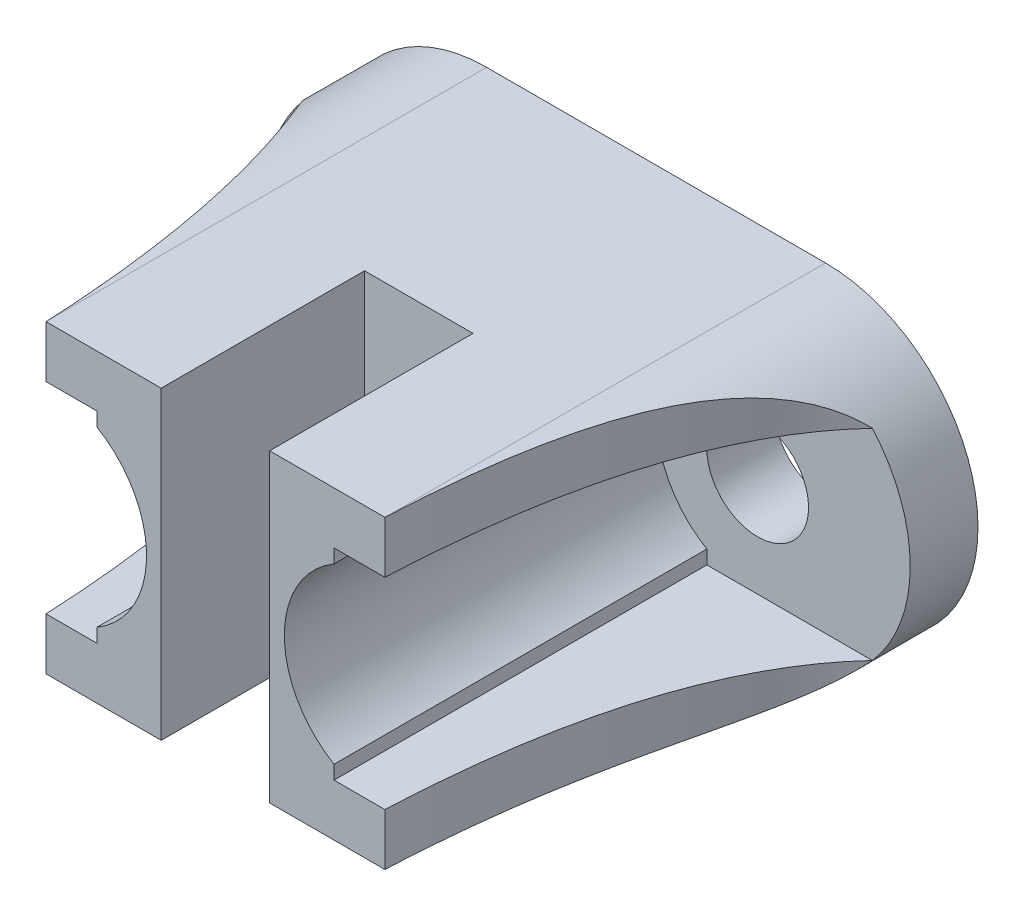
ISO-10303-21;
HEADER;
FILE_DESCRIPTION(('STEP AP214'),'2;1');
FILE_NAME('part.step','',(''),(''),'','','');
FILE_SCHEMA(('AUTOMOTIVE_DESIGN { 1 0 10303 214 1 1 1 1 }'));
ENDSEC;
DATA;
#1=APPLICATION_CONTEXT('core data for automotive mechanical design processes');
#2=APPLICATION_PROTOCOL_DEFINITION('international standard','automotive_design',2000,#1);
#3=PRODUCT_CONTEXT('',#1,'mechanical');
#4=PRODUCT('Part','Part','',(#3));
#5=PRODUCT_RELATED_PRODUCT_CATEGORY('part','',(#4));
#6=PRODUCT_DEFINITION_FORMATION('','',#4);
#7=PRODUCT_DEFINITION_CONTEXT('part definition',#1,'design');
#8=PRODUCT_DEFINITION('design','',#6,#7);
#9=PRODUCT_DEFINITION_SHAPE('','',#8);
#10=(LENGTH_UNIT() NAMED_UNIT(*) SI_UNIT(.MILLI.,.METRE.));
#11=(NAMED_UNIT(*) PLANE_ANGLE_UNIT() SI_UNIT($,.RADIAN.));
#12=(NAMED_UNIT(*) SI_UNIT($,.STERADIAN.) SOLID_ANGLE_UNIT());
#13=UNCERTAINTY_MEASURE_WITH_UNIT(LENGTH_MEASURE(1.E-05),#10,'distance_accuracy_value','');
#14=(GEOMETRIC_REPRESENTATION_CONTEXT(3) GLOBAL_UNCERTAINTY_ASSIGNED_CONTEXT((#13)) GLOBAL_UNIT_ASSIGNED_CONTEXT((#10,
#11,#12)) REPRESENTATION_CONTEXT('',''));
#15=CARTESIAN_POINT('',(0.,0.,0.));
#16=DIRECTION('',(0.,0.,1.));
#17=DIRECTION('',(1.,0.,0.));
#18=AXIS2_PLACEMENT_3D('',#15,#16,#17);
#19=CARTESIAN_POINT('',(3.49999999999999,-16.4940969782877,7.));
#20=DIRECTION('',(1.,0.,0.));
#21=DIRECTION('',(0.,0.,-1.));
#22=AXIS2_PLACEMENT_3D('',#19,#20,#21);
#23=PLANE('',#22);
#24=DIRECTION('',(0.,0.,1.));
#25=VECTOR('',#24,1.);
#26=CARTESIAN_POINT('',(3.49999999999999,2.55979014832935,-6.39167473320268));
#27=LINE('',#26,#25);
#28=CARTESIAN_POINT('',(3.49999999999999,2.55979014832935,2.));
#29=VERTEX_POINT('',#28);
#30=CARTESIAN_POINT('',(3.49999999999999,2.55979014832935,13.));
#31=VERTEX_POINT('',#30);
#32=EDGE_CURVE('E52',#29,#31,#27,.T.);
#33=ORIENTED_EDGE('',*,*,#32,.F.);
#34=DIRECTION('',(0.,-1.,0.));
#35=VECTOR('',#34,1.);
#36=CARTESIAN_POINT('',(3.49999999999999,-16.4940969782877,2.));
#37=LINE('',#36,#35);
#38=CARTESIAN_POINT('',(3.49999999999999,2.96690505467971,2.));
#39=VERTEX_POINT('',#38);
#40=EDGE_CURVE('E237',#39,#29,#37,.T.);
#41=ORIENTED_EDGE('',*,*,#40,.F.);
#42=DIRECTION('',(0.,0.,-1.));
#43=VECTOR('',#42,1.);
#44=CARTESIAN_POINT('',(3.49999999999999,2.96690505467971,13.));
#45=LINE('',#44,#43);
#46=CARTESIAN_POINT('',(3.49999999999999,2.96690505467971,13.));
#47=VERTEX_POINT('',#46);
#48=EDGE_CURVE('E668',#47,#39,#45,.T.);
#49=ORIENTED_EDGE('',*,*,#48,.F.);
#50=DIRECTION('',(0.,-1.,0.));
#51=VECTOR('',#50,1.);
#52=CARTESIAN_POINT('',(3.49999999999999,-16.4940969782877,13.));
#53=LINE('',#52,#51);
#54=EDGE_CURVE('E194',#47,#31,#53,.T.);
#55=ORIENTED_EDGE('',*,*,#54,.T.);
#56=EDGE_LOOP('',(#33,#41,#49,#55));
#57=FACE_BOUND('',#56,.T.);
#58=ADVANCED_FACE('F33',(#57),#23,.T.);
#59=CARTESIAN_POINT('',(-3.49999999999999,-16.4940969782877,7.));
#60=DIRECTION('',(1.,0.,0.));
#61=DIRECTION('',(0.,0.,-1.));
#62=AXIS2_PLACEMENT_3D('',#59,#60,#61);
#63=PLANE('',#62);
#64=DIRECTION('',(0.,-1.,0.));
#65=VECTOR('',#64,1.);
#66=CARTESIAN_POINT('',(-3.49999999999999,-16.4940969782877,2.));
#67=LINE('',#66,#65);
#68=CARTESIAN_POINT('',(-3.49999999999999,2.96690505467971,2.));
#69=VERTEX_POINT('',#68);
#70=CARTESIAN_POINT('',(-3.49999999999999,2.55979014832935,2.));
#71=VERTEX_POINT('',#70);
#72=EDGE_CURVE('E233',#69,#71,#67,.T.);
#73=ORIENTED_EDGE('',*,*,#72,.T.);
#74=DIRECTION('',(0.,0.,1.));
#75=VECTOR('',#74,1.);
#76=CARTESIAN_POINT('',(-3.49999999999999,2.55979014832935,-6.39167473320268));
#77=LINE('',#76,#75);
#78=CARTESIAN_POINT('',(-3.49999999999999,2.55979014832935,13.));
#79=VERTEX_POINT('',#78);
#80=EDGE_CURVE('E615',#71,#79,#77,.T.);
#81=ORIENTED_EDGE('',*,*,#80,.T.);
#82=DIRECTION('',(0.,-1.,0.));
#83=VECTOR('',#82,1.);
#84=CARTESIAN_POINT('',(-3.49999999999999,-16.4940969782877,13.));
#85=LINE('',#84,#83);
#86=CARTESIAN_POINT('',(-3.49999999999999,2.96690505467971,13.));
#87=VERTEX_POINT('',#86);
#88=EDGE_CURVE('E219',#87,#79,#85,.T.);
#89=ORIENTED_EDGE('',*,*,#88,.F.);
#90=DIRECTION('',(0.,0.,-1.));
#91=VECTOR('',#90,1.);
#92=CARTESIAN_POINT('',(-3.49999999999999,2.96690505467971,13.));
#93=LINE('',#92,#91);
#94=EDGE_CURVE('E195',#87,#69,#93,.T.);
#95=ORIENTED_EDGE('',*,*,#94,.T.);
#96=EDGE_LOOP('',(#73,#81,#89,#95));
#97=FACE_BOUND('',#96,.T.);
#98=ADVANCED_FACE('F318',(#97),#63,.F.);
#99=CARTESIAN_POINT('',(-5.,0.,2.));
#100=DIRECTION('',(0.,0.,1.));
#101=DIRECTION('',(1.,0.,0.));
#102=AXIS2_PLACEMENT_3D('',#99,#100,#101);
#103=PLANE('',#102);
#104=CARTESIAN_POINT('',(5.,0.,2.));
#105=DIRECTION('',(0.,0.,1.));
#106=DIRECTION('',(-1.,0.,0.));
#107=AXIS2_PLACEMENT_3D('',#104,#105,#106);
#108=CIRCLE('',#107,4.5);
#109=CARTESIAN_POINT('',(8.38341165046702,-2.96690505467971,2.));
#110=VERTEX_POINT('',#109);
#111=CARTESIAN_POINT('',(8.38341165046702,2.96690505467971,2.));
#112=VERTEX_POINT('',#111);
#113=EDGE_CURVE('E287',#110,#112,#108,.T.);
#114=ORIENTED_EDGE('',*,*,#113,.T.);
#115=DIRECTION('',(1.,0.,0.));
#116=VECTOR('',#115,1.);
#117=CARTESIAN_POINT('',(3.49999999999999,2.96690505467971,2.));
#118=LINE('',#117,#116);
#119=EDGE_CURVE('E665',#39,#112,#118,.T.);
#120=ORIENTED_EDGE('',*,*,#119,.F.);
#121=ORIENTED_EDGE('',*,*,#40,.T.);
#122=CARTESIAN_POINT('',(5.,0.,2.));
#123=DIRECTION('',(0.,0.,1.));
#124=DIRECTION('',(1.,0.,0.));
#125=AXIS2_PLACEMENT_3D('',#122,#123,#124);
#126=CIRCLE('',#125,2.96690505467971);
#127=CARTESIAN_POINT('',(3.49999999999999,-2.55979014832936,2.));
#128=VERTEX_POINT('',#127);
#129=EDGE_CURVE('E179',#128,#29,#126,.F.);
#130=ORIENTED_EDGE('',*,*,#129,.F.);
#131=CARTESIAN_POINT('',(3.49999999999999,-2.96690505467971,2.));
#132=VERTEX_POINT('',#131);
#133=EDGE_CURVE('E38',#128,#132,#37,.T.);
#134=ORIENTED_EDGE('',*,*,#133,.T.);
#135=DIRECTION('',(-1.,0.,0.));
#136=VECTOR('',#135,1.);
#137=CARTESIAN_POINT('',(3.49999999999999,-2.96690505467971,2.));
#138=LINE('',#137,#136);
#139=EDGE_CURVE('E660',#110,#132,#138,.T.);
#140=ORIENTED_EDGE('',*,*,#139,.F.);
#141=EDGE_LOOP('',(#114,#120,#121,#130,#134,#140));
#142=FACE_BOUND('',#141,.T.);
#143=CARTESIAN_POINT('',(5.,0.,2.));
#144=DIRECTION('',(0.,0.,1.));
#145=DIRECTION('',(-1.,0.,0.));
#146=AXIS2_PLACEMENT_3D('',#143,#144,#145);
#147=CIRCLE('',#146,1.5);
#148=CARTESIAN_POINT('',(3.49999999999999,0.,2.));
#149=VERTEX_POINT('',#148);
#150=EDGE_CURVE('E306',#149,#149,#147,.T.);
#151=ORIENTED_EDGE('',*,*,#150,.F.);
#152=EDGE_LOOP('',(#151));
#153=FACE_BOUND('',#152,.T.);
#154=ADVANCED_FACE('F316',(#142,#153),#103,.T.);
#155=DIRECTION('',(0.,0.,1.));
#156=VECTOR('',#155,1.);
#157=CARTESIAN_POINT('',(3.49999999999999,-2.55979014832936,-6.39167473320268));
#158=LINE('',#157,#156);
#159=CARTESIAN_POINT('',(3.49999999999999,-2.55979014832936,13.));
#160=VERTEX_POINT('',#159);
#161=EDGE_CURVE('E174',#160,#128,#158,.F.);
#162=ORIENTED_EDGE('',*,*,#161,.F.);
#163=CARTESIAN_POINT('',(3.49999999999999,-2.96690505467971,13.));
#164=VERTEX_POINT('',#163);
#165=EDGE_CURVE('E185',#160,#164,#53,.T.);
#166=ORIENTED_EDGE('',*,*,#165,.T.);
#167=DIRECTION('',(0.,0.,-1.));
#168=VECTOR('',#167,1.);
#169=CARTESIAN_POINT('',(3.49999999999999,-2.96690505467971,13.));
#170=LINE('',#169,#168);
#171=EDGE_CURVE('E662',#164,#132,#170,.T.);
#172=ORIENTED_EDGE('',*,*,#171,.T.);
#173=ORIENTED_EDGE('',*,*,#133,.F.);
#174=EDGE_LOOP('',(#162,#166,#172,#173));
#175=FACE_BOUND('',#174,.T.);
#176=ADVANCED_FACE('F183',(#175),#23,.T.);
#177=CARTESIAN_POINT('',(-3.49999999999999,-2.55979014832935,2.));
#178=VERTEX_POINT('',#177);
#179=CARTESIAN_POINT('',(-3.49999999999999,-2.96690505467971,2.));
#180=VERTEX_POINT('',#179);
#181=EDGE_CURVE('E244',#178,#180,#67,.T.);
#182=ORIENTED_EDGE('',*,*,#181,.F.);
#183=CARTESIAN_POINT('',(-5.,0.,2.));
#184=DIRECTION('',(0.,0.,1.));
#185=DIRECTION('',(1.,0.,0.));
#186=AXIS2_PLACEMENT_3D('',#183,#184,#185);
#187=CIRCLE('',#186,2.96690505467971);
#188=EDGE_CURVE('E688',#71,#178,#187,.F.);
#189=ORIENTED_EDGE('',*,*,#188,.F.);
#190=ORIENTED_EDGE('',*,*,#72,.F.);
#191=DIRECTION('',(1.,0.,0.));
#192=VECTOR('',#191,1.);
#193=CARTESIAN_POINT('',(-3.49999999999999,2.96690505467971,2.));
#194=LINE('',#193,#192);
#195=CARTESIAN_POINT('',(-8.38341165046702,2.96690505467971,2.));
#196=VERTEX_POINT('',#195);
#197=EDGE_CURVE('E679',#196,#69,#194,.T.);
#198=ORIENTED_EDGE('',*,*,#197,.F.);
#199=CARTESIAN_POINT('',(-5.,0.,2.));
#200=DIRECTION('',(0.,0.,1.));
#201=DIRECTION('',(1.,0.,0.));
#202=AXIS2_PLACEMENT_3D('',#199,#200,#201);
#203=CIRCLE('',#202,4.5);
#204=CARTESIAN_POINT('',(-8.38341165046702,-2.96690505467971,2.));
#205=VERTEX_POINT('',#204);
#206=EDGE_CURVE('E290',#196,#205,#203,.T.);
#207=ORIENTED_EDGE('',*,*,#206,.T.);
#208=DIRECTION('',(-1.,0.,0.));
#209=VECTOR('',#208,1.);
#210=CARTESIAN_POINT('',(-3.49999999999999,-2.96690505467971,2.));
#211=LINE('',#210,#209);
#212=EDGE_CURVE('E672',#180,#205,#211,.T.);
#213=ORIENTED_EDGE('',*,*,#212,.F.);
#214=EDGE_LOOP('',(#182,#189,#190,#198,#207,#213));
#215=FACE_BOUND('',#214,.T.);
#216=CARTESIAN_POINT('',(-5.,0.,2.));
#217=DIRECTION('',(0.,0.,1.));
#218=DIRECTION('',(1.,0.,0.));
#219=AXIS2_PLACEMENT_3D('',#216,#217,#218);
#220=CIRCLE('',#219,1.5);
#221=CARTESIAN_POINT('',(-3.49999999999999,0.,2.));
#222=VERTEX_POINT('',#221);
#223=EDGE_CURVE('E298',#222,#222,#220,.T.);
#224=ORIENTED_EDGE('',*,*,#223,.F.);
#225=EDGE_LOOP('',(#224));
#226=FACE_BOUND('',#225,.T.);
#227=ADVANCED_FACE('F321',(#215,#226),#103,.T.);
#228=CARTESIAN_POINT('',(-3.49999999999999,-2.55979014832935,13.));
#229=VERTEX_POINT('',#228);
#230=CARTESIAN_POINT('',(-3.49999999999999,-2.96690505467971,13.));
#231=VERTEX_POINT('',#230);
#232=EDGE_CURVE('E218',#229,#231,#85,.T.);
#233=ORIENTED_EDGE('',*,*,#232,.F.);
#234=DIRECTION('',(0.,0.,1.));
#235=VECTOR('',#234,1.);
#236=CARTESIAN_POINT('',(-3.49999999999999,-2.55979014832935,-6.39167473320268));
#237=LINE('',#236,#235);
#238=EDGE_CURVE('E60',#229,#178,#237,.F.);
#239=ORIENTED_EDGE('',*,*,#238,.T.);
#240=ORIENTED_EDGE('',*,*,#181,.T.);
#241=DIRECTION('',(0.,0.,-1.));
#242=VECTOR('',#241,1.);
#243=CARTESIAN_POINT('',(-3.49999999999999,-2.96690505467971,13.));
#244=LINE('',#243,#242);
#245=EDGE_CURVE('E675',#231,#180,#244,.T.);
#246=ORIENTED_EDGE('',*,*,#245,.F.);
#247=EDGE_LOOP('',(#233,#239,#240,#246));
#248=FACE_BOUND('',#247,.T.);
#249=ADVANCED_FACE('F329',(#248),#63,.F.);
#250=CARTESIAN_POINT('',(0.,-16.4940969782877,7.));
#251=DIRECTION('',(0.,0.,1.));
#252=DIRECTION('',(1.,0.,0.));
#253=AXIS2_PLACEMENT_3D('',#250,#251,#252);
#254=PLANE('',#253);
#255=DIRECTION('',(1.,0.,0.));
#256=VECTOR('',#255,1.);
#257=CARTESIAN_POINT('',(0.,-4.5,7.));
#258=LINE('',#257,#256);
#259=CARTESIAN_POINT('',(-1.6,-4.5,7.));
#260=VERTEX_POINT('',#259);
#261=CARTESIAN_POINT('',(1.6,-4.5,7.));
#262=VERTEX_POINT('',#261);
#263=EDGE_CURVE('E236',#260,#262,#258,.T.);
#264=ORIENTED_EDGE('',*,*,#263,.T.);
#265=DIRECTION('',(0.,1.,0.));
#266=VECTOR('',#265,1.);
#267=CARTESIAN_POINT('',(1.6,-16.4940969782877,7.));
#268=LINE('',#267,#266);
#269=CARTESIAN_POINT('',(1.6,4.5,7.));
#270=VERTEX_POINT('',#269);
#271=EDGE_CURVE('E249',#262,#270,#268,.T.);
#272=ORIENTED_EDGE('',*,*,#271,.T.);
#273=DIRECTION('',(-1.,0.,0.));
#274=VECTOR('',#273,1.);
#275=CARTESIAN_POINT('',(0.,4.5,7.));
#276=LINE('',#275,#274);
#277=CARTESIAN_POINT('',(-1.6,4.5,7.));
#278=VERTEX_POINT('',#277);
#279=EDGE_CURVE('E234',#270,#278,#276,.T.);
#280=ORIENTED_EDGE('',*,*,#279,.T.);
#281=DIRECTION('',(0.,1.,0.));
#282=VECTOR('',#281,1.);
#283=CARTESIAN_POINT('',(-1.6,-16.4940969782877,7.));
#284=LINE('',#283,#282);
#285=EDGE_CURVE('E268',#260,#278,#284,.T.);
#286=ORIENTED_EDGE('',*,*,#285,.F.);
#287=EDGE_LOOP('',(#264,#272,#280,#286));
#288=FACE_BOUND('',#287,.T.);
#289=ADVANCED_FACE('F339',(#288),#254,.T.);
#290=CARTESIAN_POINT('',(-5.,0.,0.));
#291=DIRECTION('',(0.,0.,1.));
#292=DIRECTION('',(1.,0.,0.));
#293=AXIS2_PLACEMENT_3D('',#290,#291,#292);
#294=PLANE('',#293);
#295=CARTESIAN_POINT('',(-5.,0.,0.));
#296=DIRECTION('',(0.,0.,1.));
#297=DIRECTION('',(1.,0.,0.));
#298=AXIS2_PLACEMENT_3D('',#295,#296,#297);
#299=CIRCLE('',#298,1.5);
#300=CARTESIAN_POINT('',(-3.49999999999999,0.,0.));
#301=VERTEX_POINT('',#300);
#302=EDGE_CURVE('E303',#301,#301,#299,.T.);
#303=ORIENTED_EDGE('',*,*,#302,.T.);
#304=EDGE_LOOP('',(#303));
#305=FACE_BOUND('',#304,.T.);
#306=CARTESIAN_POINT('',(-5.,0.,0.));
#307=DIRECTION('',(0.,0.,1.));
#308=DIRECTION('',(1.,0.,0.));
#309=AXIS2_PLACEMENT_3D('',#306,#307,#308);
#310=CIRCLE('',#309,4.5);
#311=CARTESIAN_POINT('',(-5.,4.5,0.));
#312=VERTEX_POINT('',#311);
#313=CARTESIAN_POINT('',(-5.,-4.5,0.));
#314=VERTEX_POINT('',#313);
#315=EDGE_CURVE('E295',#312,#314,#310,.T.);
#316=ORIENTED_EDGE('',*,*,#315,.F.);
#317=DIRECTION('',(-1.,0.,0.));
#318=VECTOR('',#317,1.);
#319=CARTESIAN_POINT('',(-5.,4.5,0.));
#320=LINE('',#319,#318);
#321=CARTESIAN_POINT('',(5.,4.5,0.));
#322=VERTEX_POINT('',#321);
#323=EDGE_CURVE('E288',#322,#312,#320,.T.);
#324=ORIENTED_EDGE('',*,*,#323,.F.);
#325=CARTESIAN_POINT('',(5.,0.,0.));
#326=DIRECTION('',(0.,0.,1.));
#327=DIRECTION('',(-1.,0.,0.));
#328=AXIS2_PLACEMENT_3D('',#325,#326,#327);
#329=CIRCLE('',#328,4.5);
#330=CARTESIAN_POINT('',(5.,-4.5,0.));
#331=VERTEX_POINT('',#330);
#332=EDGE_CURVE('E291',#331,#322,#329,.T.);
#333=ORIENTED_EDGE('',*,*,#332,.F.);
#334=DIRECTION('',(1.,0.,0.));
#335=VECTOR('',#334,1.);
#336=CARTESIAN_POINT('',(-5.,-4.5,0.));
#337=LINE('',#336,#335);
#338=EDGE_CURVE('E293',#314,#331,#337,.T.);
#339=ORIENTED_EDGE('',*,*,#338,.F.);
#340=EDGE_LOOP('',(#316,#324,#333,#339));
#341=FACE_BOUND('',#340,.T.);
#342=CARTESIAN_POINT('',(5.,0.,0.));
#343=DIRECTION('',(0.,0.,1.));
#344=DIRECTION('',(-1.,0.,0.));
#345=AXIS2_PLACEMENT_3D('',#342,#343,#344);
#346=CIRCLE('',#345,1.5);
#347=CARTESIAN_POINT('',(3.49999999999999,0.,0.));
#348=VERTEX_POINT('',#347);
#349=EDGE_CURVE('E239',#348,#348,#346,.T.);
#350=ORIENTED_EDGE('',*,*,#349,.T.);
#351=EDGE_LOOP('',(#350));
#352=FACE_BOUND('',#351,.T.);
#353=ADVANCED_FACE('F360',(#305,#341,#352),#294,.F.);
#354=CARTESIAN_POINT('',(-5.,0.,2.));
#355=DIRECTION('',(0.,0.,-1.));
#356=DIRECTION('',(-1.,0.,0.));
#357=AXIS2_PLACEMENT_3D('',#354,#355,#356);
#358=CYLINDRICAL_SURFACE('',#357,4.5);
#359=DIRECTION('',(0.,0.,-1.));
#360=VECTOR('',#359,1.);
#361=CARTESIAN_POINT('',(-5.,-4.5,2.));
#362=LINE('',#361,#360);
#363=CARTESIAN_POINT('',(-5.,-4.5,13.));
#364=VERTEX_POINT('',#363);
#365=EDGE_CURVE('E275',#364,#314,#362,.T.);
#366=ORIENTED_EDGE('',*,*,#365,.F.);
#367=CARTESIAN_POINT('',(-5.,-4.5,13.));
#368=CARTESIAN_POINT('',(-5.00847460033084,-4.49999666570553,12.8143599373574));
#369=CARTESIAN_POINT('',(-5.01817714724121,-4.4999758552831,12.6287733098969));
#370=CARTESIAN_POINT('',(-5.04021216471963,-4.49983473708577,12.2576407562599));
#371=CARTESIAN_POINT('',(-5.05254626865155,-4.49971436738198,12.0720949273356));
#372=CARTESIAN_POINT('',(-5.08001304409151,-4.49930935896203,11.701144938476));
#373=CARTESIAN_POINT('',(-5.09514668158771,-4.49902466347261,11.5157408496897));
#374=CARTESIAN_POINT('',(-5.12839982708478,-4.49819862811249,11.145178626702));
#375=CARTESIAN_POINT('',(-5.14651967982898,-4.49765725859652,10.9600205233892));
#376=CARTESIAN_POINT('',(-5.18639007749422,-4.49618348408227,10.5859116527614));
#377=CARTESIAN_POINT('',(-5.20821268664725,-4.49524261382885,10.3969685616433));
#378=CARTESIAN_POINT('',(-5.25543104493743,-4.49280692375679,10.0195591618742));
#379=CARTESIAN_POINT('',(-5.28082627483975,-4.49131218438448,9.83109278798324));
#380=CARTESIAN_POINT('',(-5.33545480331584,-4.48756289172359,9.45475239179159));
#381=CARTESIAN_POINT('',(-5.36468749070826,-4.48530845933982,9.266878280032));
#382=CARTESIAN_POINT('',(-5.42728599742382,-4.47977815453613,8.89184610957285));
#383=CARTESIAN_POINT('',(-5.46065155923922,-4.47650234573601,8.70468800700908));
#384=CARTESIAN_POINT('',(-5.54387227073326,-4.46727117582095,8.26812053860519));
#385=CARTESIAN_POINT('',(-5.59548892783675,-4.46078435541045,8.01905361033608));
#386=CARTESIAN_POINT('',(-5.70756945500679,-4.44438486544917,7.52296719791227));
#387=CARTESIAN_POINT('',(-5.7680349823156,-4.43447155370042,7.27594810645918));
#388=CARTESIAN_POINT('',(-5.89881617695277,-4.40982645292181,6.78452569941807));
#389=CARTESIAN_POINT('',(-5.96914003110226,-4.39509064534973,6.54012474150819));
#390=CARTESIAN_POINT('',(-6.12003405018721,-4.35907132918473,6.05706166289342));
#391=CARTESIAN_POINT('',(-6.20051972086066,-4.33783996515027,5.81836959877135));
#392=CARTESIAN_POINT('',(-6.37308744697205,-4.28634383015577,5.34634666531763));
#393=CARTESIAN_POINT('',(-6.46516140194898,-4.25608534929205,5.11301218434905));
#394=CARTESIAN_POINT('',(-6.66164686462298,-4.18329081204294,4.65383190279578));
#395=CARTESIAN_POINT('',(-6.76603985587184,-4.14077304687441,4.42797550031211));
#396=CARTESIAN_POINT('',(-6.94552990776975,-4.05839908968363,4.06999166966545));
#397=CARTESIAN_POINT('',(-7.01675667289867,-4.02362860075528,3.93474953919295));
#398=CARTESIAN_POINT('',(-7.16393702262359,-3.9464278749724,3.66904680776301));
#399=CARTESIAN_POINT('',(-7.23989106899878,-3.90399688903885,3.53858667591382));
#400=CARTESIAN_POINT('',(-7.39574180890553,-3.81033444924241,3.28412722791626));
#401=CARTESIAN_POINT('',(-7.47561987206389,-3.75914216519618,3.160102226565));
#402=CARTESIAN_POINT('',(-7.63880221930772,-3.64644266516411,2.91920417826457));
#403=CARTESIAN_POINT('',(-7.72210485959287,-3.5849403553582,2.80232776548881));
#404=CARTESIAN_POINT('',(-7.85393571039979,-3.47976087412051,2.62636067075946));
#405=CARTESIAN_POINT('',(-7.90174728210216,-3.44004372632298,2.56434304543143));
#406=CARTESIAN_POINT('',(-7.99772280378476,-3.35673879966761,2.44327223659151));
#407=CARTESIAN_POINT('',(-8.04588664941008,-3.31315212761294,2.38421821291458));
#408=CARTESIAN_POINT('',(-8.14254879993827,-3.22162153820976,2.26891852935026));
#409=CARTESIAN_POINT('',(-8.19104712673594,-3.17364971328072,2.21269497943345));
#410=CARTESIAN_POINT('',(-8.28764548263125,-3.07347299090167,2.10369261037172));
#411=CARTESIAN_POINT('',(-8.33574522003508,-3.02126525128272,2.05091614769793));
#412=CARTESIAN_POINT('',(-8.38341165046702,-2.96690505467971,2.));
#413=B_SPLINE_CURVE_WITH_KNOTS('',3,(#367,#368,#369,#370,#371,#372,#373,#374,#375,#376,#377,
#378,#379,#380,#381,#382,#383,#384,#385,#386,#387,#388,#389,#390,#391,#392,#393,#394,#395,#396,
#397,#398,#399,#400,#401,#402,#403,#404,#405,#406,#407,#408,#409,#410,#411,#412),.UNSPECIFIED.,
.F.,.F.,(4,2,2,2,2,2,2,2,2,2,2,2,2,2,2,2,2,2,2,2,2,2,4),(0.,0.557500000282832,1.11534704350259,
1.6733869339198,2.23149129238606,2.80206325613718,3.37255238003992,3.9429507536892,
4.51331360528663,5.27647395859446,6.03977742214603,6.80371856605856,7.5616811362273,
8.31911678665459,9.07542811730855,9.54542648588452,10.0154708380027,10.4834661462929,
10.9512393809303,11.2145361659743,11.4777578811855,11.7427900631665,12.0080015680184),.UNSPECIFIED.);
#414=EDGE_CURVE('E643',#364,#205,#413,.T.);
#415=ORIENTED_EDGE('',*,*,#414,.T.);
#416=ORIENTED_EDGE('',*,*,#206,.F.);
#417=CARTESIAN_POINT('',(-8.38341165046702,2.96690505467971,2.));
#418=CARTESIAN_POINT('',(-8.33050518621575,3.02724138401667,2.05650773887513));
#419=CARTESIAN_POINT('',(-8.27706995268705,3.08492041474041,2.11530955836868));
#420=CARTESIAN_POINT('',(-8.16986698772481,3.19496845003632,2.23701719094767));
#421=CARTESIAN_POINT('',(-8.11610048234729,3.24735087355108,2.2999119336983));
#422=CARTESIAN_POINT('',(-8.00871985698899,3.34708434173324,2.42956893638766));
#423=CARTESIAN_POINT('',(-7.95510565188878,3.39443920546351,2.49632820029693));
#424=CARTESIAN_POINT('',(-7.8493172945852,3.4836910279536,2.63230996499256));
#425=CARTESIAN_POINT('',(-7.79713381667122,3.52566304474419,2.70147613331802));
#426=CARTESIAN_POINT('',(-7.69368263149919,3.60532109043665,2.84296133298546));
#427=CARTESIAN_POINT('',(-7.64241548198451,3.64300457921759,2.91528219815711));
#428=CARTESIAN_POINT('',(-7.54111337861112,3.71437461105259,3.06272321906141));
#429=CARTESIAN_POINT('',(-7.49107876971973,3.74806004496822,3.1378441440256));
#430=CARTESIAN_POINT('',(-7.33492927005494,3.84893811973922,3.37972711153595));
#431=CARTESIAN_POINT('',(-7.23152333115042,3.9093481446902,3.55110997373991));
#432=CARTESIAN_POINT('',(-7.03301610482994,4.0161615171744,3.9027425858471));
#433=CARTESIAN_POINT('',(-6.93791831228106,4.06255899022251,4.08299601783601));
#434=CARTESIAN_POINT('',(-6.75572054689924,4.14457403129928,4.45159521438943));
#435=CARTESIAN_POINT('',(-6.66868658647381,4.18010731311108,4.63999191949796));
#436=CARTESIAN_POINT('',(-6.50329960434594,4.24239252992967,5.02189798399608));
#437=CARTESIAN_POINT('',(-6.42494564566961,4.26914541336087,5.21540678875521));
#438=CARTESIAN_POINT('',(-6.28738190739821,4.31242872790334,5.57760069195184));
#439=CARTESIAN_POINT('',(-6.22705084023456,4.32988360841603,5.74575535519708));
#440=CARTESIAN_POINT('',(-6.11202981065538,4.36084143089443,6.08435811803582));
#441=CARTESIAN_POINT('',(-6.05734060443621,4.37434384354295,6.25480652161446));
#442=CARTESIAN_POINT('',(-5.95324997770117,4.39820000135609,6.59753193837916));
#443=CARTESIAN_POINT('',(-5.90384894864239,4.40855351352779,6.76980908590177));
#444=CARTESIAN_POINT('',(-5.81004965291349,4.42674792967975,7.11557402986315));
#445=CARTESIAN_POINT('',(-5.76564418892958,4.43459247927491,7.28905969202799));
#446=CARTESIAN_POINT('',(-5.681417012596,4.44831323221483,7.6371909123884));
#447=CARTESIAN_POINT('',(-5.64159476132739,4.45418966713668,7.81183633165389));
#448=CARTESIAN_POINT('',(-5.56621022236916,4.46439806419708,8.16207913261047));
#449=CARTESIAN_POINT('',(-5.53064782271342,4.46873006693545,8.33767648915394));
#450=CARTESIAN_POINT('',(-5.4499295107877,4.47770268904837,8.7606848541572));
#451=CARTESIAN_POINT('',(-5.4066947637878,4.48176217291088,9.00847539239539));
#452=CARTESIAN_POINT('',(-5.32728618826428,4.4882585606423,9.50522960124113));
#453=CARTESIAN_POINT('',(-5.29111334256317,4.49069523877489,9.75419343020761));
#454=CARTESIAN_POINT('',(-5.22517862114553,4.4944838138677,10.2530250318788));
#455=CARTESIAN_POINT('',(-5.19541809864848,4.49583548201742,10.5028929840941));
#456=CARTESIAN_POINT('',(-5.14186569835112,4.49784228003636,11.0021466625177));
#457=CARTESIAN_POINT('',(-5.11804797537225,4.49850046761946,11.2515296249555));
#458=CARTESIAN_POINT('',(-5.07571696433395,4.49941346533509,11.7506777937112));
#459=CARTESIAN_POINT('',(-5.0572023304532,4.49966837788541,12.0004428868469));
#460=CARTESIAN_POINT('',(-5.02505456496776,4.49995571676912,12.500108108358));
#461=CARTESIAN_POINT('',(-5.01141793015206,4.49998830307476,12.7500080102205));
#462=CARTESIAN_POINT('',(-5.,4.5,13.));
#463=B_SPLINE_CURVE_WITH_KNOTS('',3,(#417,#418,#419,#420,#421,#422,#423,#424,#425,#426,#427,
#428,#429,#430,#431,#432,#433,#434,#435,#436,#437,#438,#439,#440,#441,#442,#443,#444,#445,#446,
#447,#448,#449,#450,#451,#452,#453,#454,#455,#456,#457,#458,#459,#460,#461,#462),.UNSPECIFIED.,
.F.,.F.,(4,2,2,2,2,2,2,2,2,2,2,2,2,2,2,2,2,2,2,2,2,2,4),(0.,0.294334894074351,0.587904353818667,
0.881249190618479,1.16991133884714,1.45874358319248,1.74765576887067,2.37379061246815,
3.00018758749243,3.63132767141786,4.26239955959643,4.80074348475618,5.33915947235207,
5.8776152886478,6.41528511639034,6.95289165727432,7.4904840645817,8.24505558597535,
8.99973204823366,9.75456761738187,10.5060608355069,11.2573631698857,12.0081248563811),.UNSPECIFIED.);
#464=CARTESIAN_POINT('',(-5.,4.5,13.));
#465=VERTEX_POINT('',#464);
#466=EDGE_CURVE('E375',#196,#465,#463,.T.);
#467=ORIENTED_EDGE('',*,*,#466,.T.);
#468=DIRECTION('',(0.,0.,-1.));
#469=VECTOR('',#468,1.);
#470=CARTESIAN_POINT('',(-5.,4.5,2.));
#471=LINE('',#470,#469);
#472=EDGE_CURVE('E284',#465,#312,#471,.T.);
#473=ORIENTED_EDGE('',*,*,#472,.T.);
#474=ORIENTED_EDGE('',*,*,#315,.T.);
#475=EDGE_LOOP('',(#366,#415,#416,#467,#473,#474));
#476=FACE_BOUND('',#475,.T.);
#477=ADVANCED_FACE('F35',(#476),#358,.T.);
#478=CARTESIAN_POINT('',(-5.,-4.5,2.));
#479=DIRECTION('',(0.,1.,0.));
#480=DIRECTION('',(0.,0.,1.));
#481=AXIS2_PLACEMENT_3D('',#478,#479,#480);
#482=PLANE('',#481);
#483=DIRECTION('',(0.,0.,-1.));
#484=VECTOR('',#483,1.);
#485=CARTESIAN_POINT('',(5.,-4.5,2.));
#486=LINE('',#485,#484);
#487=CARTESIAN_POINT('',(5.,-4.5,13.));
#488=VERTEX_POINT('',#487);
#489=EDGE_CURVE('E278',#488,#331,#486,.T.);
#490=ORIENTED_EDGE('',*,*,#489,.F.);
#491=DIRECTION('',(1.,0.,0.));
#492=VECTOR('',#491,1.);
#493=CARTESIAN_POINT('',(0.,-4.5,13.));
#494=LINE('',#493,#492);
#495=CARTESIAN_POINT('',(1.6,-4.5,13.));
#496=VERTEX_POINT('',#495);
#497=EDGE_CURVE('E206',#496,#488,#494,.T.);
#498=ORIENTED_EDGE('',*,*,#497,.F.);
#499=DIRECTION('',(0.,0.,-1.));
#500=VECTOR('',#499,1.);
#501=CARTESIAN_POINT('',(1.6,-4.5,13.));
#502=LINE('',#501,#500);
#503=EDGE_CURVE('E209',#496,#262,#502,.T.);
#504=ORIENTED_EDGE('',*,*,#503,.T.);
#505=ORIENTED_EDGE('',*,*,#263,.F.);
#506=DIRECTION('',(0.,0.,-1.));
#507=VECTOR('',#506,1.);
#508=CARTESIAN_POINT('',(-1.6,-4.5,13.));
#509=LINE('',#508,#507);
#510=CARTESIAN_POINT('',(-1.6,-4.5,13.));
#511=VERTEX_POINT('',#510);
#512=EDGE_CURVE('E230',#511,#260,#509,.T.);
#513=ORIENTED_EDGE('',*,*,#512,.F.);
#514=DIRECTION('',(1.,0.,0.));
#515=VECTOR('',#514,1.);
#516=CARTESIAN_POINT('',(0.,-4.5,13.));
#517=LINE('',#516,#515);
#518=EDGE_CURVE('E222',#364,#511,#517,.T.);
#519=ORIENTED_EDGE('',*,*,#518,.F.);
#520=ORIENTED_EDGE('',*,*,#365,.T.);
#521=ORIENTED_EDGE('',*,*,#338,.T.);
#522=EDGE_LOOP('',(#490,#498,#504,#505,#513,#519,#520,#521));
#523=FACE_BOUND('',#522,.T.);
#524=ADVANCED_FACE('F404',(#523),#482,.F.);
#525=CARTESIAN_POINT('',(5.,0.,2.));
#526=DIRECTION('',(0.,0.,-1.));
#527=DIRECTION('',(-1.,0.,0.));
#528=AXIS2_PLACEMENT_3D('',#525,#526,#527);
#529=CYLINDRICAL_SURFACE('',#528,4.5);
#530=DIRECTION('',(0.,0.,-1.));
#531=VECTOR('',#530,1.);
#532=CARTESIAN_POINT('',(5.,4.5,2.));
#533=LINE('',#532,#531);
#534=CARTESIAN_POINT('',(5.,4.5,13.));
#535=VERTEX_POINT('',#534);
#536=EDGE_CURVE('E281',#535,#322,#533,.T.);
#537=ORIENTED_EDGE('',*,*,#536,.F.);
#538=CARTESIAN_POINT('',(5.,4.5,12.9999999999997));
#539=CARTESIAN_POINT('',(5.00847460033086,4.49999666570552,12.814359937357));
#540=CARTESIAN_POINT('',(5.01817714724123,4.4999758552831,12.6287733098965));
#541=CARTESIAN_POINT('',(5.04021216471966,4.49983473708577,12.2576407562596));
#542=CARTESIAN_POINT('',(5.05254626865158,4.49971436738198,12.0720949273353));
#543=CARTESIAN_POINT('',(5.08001304409154,4.49930935896203,11.7011449384757));
#544=CARTESIAN_POINT('',(5.09514668158774,4.49902466347261,11.5157408496894));
#545=CARTESIAN_POINT('',(5.12839982708481,4.49819862811249,11.1451786267017));
#546=CARTESIAN_POINT('',(5.14651967982902,4.49765725859652,10.9600205233889));
#547=CARTESIAN_POINT('',(5.18639007749426,4.49618348408227,10.5859116527611));
#548=CARTESIAN_POINT('',(5.20821268664729,4.49524261382884,10.396968561643));
#549=CARTESIAN_POINT('',(5.25543104493747,4.49280692375679,10.0195591618739));
#550=CARTESIAN_POINT('',(5.2808262748398,4.49131218438448,9.83109278798291));
#551=CARTESIAN_POINT('',(5.33545480331589,4.48756289172358,9.45475239179126));
#552=CARTESIAN_POINT('',(5.36468749070831,4.48530845933982,9.26687828003168));
#553=CARTESIAN_POINT('',(5.42728599742388,4.47977815453613,8.89184610957252));
#554=CARTESIAN_POINT('',(5.46065155923928,4.476502345736,8.70468800700876));
#555=CARTESIAN_POINT('',(5.54387227073332,4.46727117582094,8.26812053860487));
#556=CARTESIAN_POINT('',(5.59548892783682,4.46078435541044,8.01905361033576));
#557=CARTESIAN_POINT('',(5.70756945500687,4.44438486544915,7.52296719791194));
#558=CARTESIAN_POINT('',(5.76803498231569,4.4344715537004,7.27594810645886));
#559=CARTESIAN_POINT('',(5.89881617695287,4.40982645292179,6.78452569941775));
#560=CARTESIAN_POINT('',(5.96914003110235,4.3950906453497,6.54012474150787));
#561=CARTESIAN_POINT('',(6.12003405018731,4.3590713291847,6.0570616628931));
#562=CARTESIAN_POINT('',(6.20051972086077,4.33783996515024,5.81836959877103));
#563=CARTESIAN_POINT('',(6.37308744697218,4.28634383015573,5.34634666531731));
#564=CARTESIAN_POINT('',(6.46516140194911,4.256085349292,5.11301218434873));
#565=CARTESIAN_POINT('',(6.66164686462311,4.18329081204289,4.65383190279547));
#566=CARTESIAN_POINT('',(6.76603985587199,4.14077304687435,4.42797550031181));
#567=CARTESIAN_POINT('',(6.9455299077699,4.05839908968356,4.06999166966516));
#568=CARTESIAN_POINT('',(7.01675667289882,4.0236286007552,3.93474953919267));
#569=CARTESIAN_POINT('',(7.16393702262374,3.94642787497231,3.66904680776275));
#570=CARTESIAN_POINT('',(7.23989106899893,3.90399688903877,3.53858667591357));
#571=CARTESIAN_POINT('',(7.39574180890568,3.81033444924231,3.28412722791602));
#572=CARTESIAN_POINT('',(7.47561987206403,3.75914216519608,3.16010222656477));
#573=CARTESIAN_POINT('',(7.63880221930786,3.646442665164,2.91920417826436));
#574=CARTESIAN_POINT('',(7.72210485959302,3.5849403553581,2.8023277654886));
#575=CARTESIAN_POINT('',(7.85393571039993,3.4797608741204,2.62636067075929));
#576=CARTESIAN_POINT('',(7.90174728210228,3.44004372632287,2.56434304543128));
#577=CARTESIAN_POINT('',(7.99772280378486,3.35673879966752,2.4432722365914));
#578=CARTESIAN_POINT('',(8.04588664941016,3.31315212761286,2.38421821291447));
#579=CARTESIAN_POINT('',(8.14254879993833,3.2216215382097,2.26891852935019));
#580=CARTESIAN_POINT('',(8.19104712673599,3.17364971328067,2.2126949794334));
#581=CARTESIAN_POINT('',(8.28764548263128,3.07347299090164,2.10369261037169));
#582=CARTESIAN_POINT('',(8.33574522003509,3.02126525128271,2.05091614769791));
#583=CARTESIAN_POINT('',(8.38341165046702,2.96690505467971,2.));
#584=B_SPLINE_CURVE_WITH_KNOTS('',3,(#538,#539,#540,#541,#542,#543,#544,#545,#546,#547,#548,
#549,#550,#551,#552,#553,#554,#555,#556,#557,#558,#559,#560,#561,#562,#563,#564,#565,#566,#567,
#568,#569,#570,#571,#572,#573,#574,#575,#576,#577,#578,#579,#580,#581,#582,#583),.UNSPECIFIED.,
.F.,.F.,(4,2,2,2,2,2,2,2,2,2,2,2,2,2,2,2,2,2,2,2,2,2,4),(0.,0.557500000282831,1.11534704350259,
1.67338693391979,2.23149129238605,2.80206325613718,3.37255238003992,3.9429507536892,
4.51331360528663,5.27647395859446,6.03977742214604,6.80371856605857,7.56168113622731,
8.3191167866546,9.07542811730856,9.54542648588451,10.0154708380027,10.4834661462929,
10.9512393809302,11.2145361659741,11.4777578811853,11.7427900631662,12.008001568018),.UNSPECIFIED.);
#585=EDGE_CURVE('E399',#535,#112,#584,.T.);
#586=ORIENTED_EDGE('',*,*,#585,.T.);
#587=ORIENTED_EDGE('',*,*,#113,.F.);
#588=CARTESIAN_POINT('',(8.38341165046702,-2.96690505467971,2.));
#589=CARTESIAN_POINT('',(8.33050518621575,-3.02724138401667,2.05650773887513));
#590=CARTESIAN_POINT('',(8.27706995268705,-3.08492041474041,2.11530955836867));
#591=CARTESIAN_POINT('',(8.16986698772481,-3.19496845003632,2.23701719094767));
#592=CARTESIAN_POINT('',(8.11610048234729,-3.24735087355108,2.29991193369829));
#593=CARTESIAN_POINT('',(8.00871985698899,-3.34708434173324,2.42956893638766));
#594=CARTESIAN_POINT('',(7.95510565188878,-3.39443920546351,2.49632820029693));
#595=CARTESIAN_POINT('',(7.8493172945852,-3.4836910279536,2.63230996499256));
#596=CARTESIAN_POINT('',(7.79713381667122,-3.52566304474419,2.70147613331802));
#597=CARTESIAN_POINT('',(7.69368263149919,-3.60532109043665,2.84296133298546));
#598=CARTESIAN_POINT('',(7.6424154819845,-3.64300457921759,2.9152821981571));
#599=CARTESIAN_POINT('',(7.54111337861112,-3.71437461105259,3.06272321906141));
#600=CARTESIAN_POINT('',(7.49107876971973,-3.74806004496823,3.1378441440256));
#601=CARTESIAN_POINT('',(7.33492927005494,-3.84893811973922,3.37972711153595));
#602=CARTESIAN_POINT('',(7.23152333115042,-3.9093481446902,3.55110997373991));
#603=CARTESIAN_POINT('',(7.03301610482994,-4.0161615171744,3.9027425858471));
#604=CARTESIAN_POINT('',(6.93791831228106,-4.06255899022251,4.082996017836));
#605=CARTESIAN_POINT('',(6.75572054689924,-4.14457403129928,4.45159521438942));
#606=CARTESIAN_POINT('',(6.66868658647381,-4.18010731311108,4.63999191949795));
#607=CARTESIAN_POINT('',(6.50329960434594,-4.24239252992967,5.02189798399607));
#608=CARTESIAN_POINT('',(6.42494564566962,-4.26914541336087,5.2154067887552));
#609=CARTESIAN_POINT('',(6.28738190739821,-4.31242872790334,5.57760069195183));
#610=CARTESIAN_POINT('',(6.22705084023456,-4.32988360841603,5.74575535519707));
#611=CARTESIAN_POINT('',(6.11202981065538,-4.36084143089443,6.08435811803582));
#612=CARTESIAN_POINT('',(6.05734060443621,-4.37434384354295,6.25480652161446));
#613=CARTESIAN_POINT('',(5.95324997770117,-4.3982000013561,6.59753193837915));
#614=CARTESIAN_POINT('',(5.90384894864239,-4.4085535135278,6.76980908590177));
#615=CARTESIAN_POINT('',(5.81004965291349,-4.42674792967975,7.11557402986314));
#616=CARTESIAN_POINT('',(5.76564418892959,-4.43459247927491,7.28905969202798));
#617=CARTESIAN_POINT('',(5.68141701259601,-4.44831323221483,7.63719091238838));
#618=CARTESIAN_POINT('',(5.64159476132739,-4.45418966713669,7.81183633165388));
#619=CARTESIAN_POINT('',(5.56621022236916,-4.46439806419708,8.16207913261046));
#620=CARTESIAN_POINT('',(5.53064782271342,-4.46873006693546,8.33767648915392));
#621=CARTESIAN_POINT('',(5.4499295107877,-4.47770268904837,8.76068485415718));
#622=CARTESIAN_POINT('',(5.40669476378781,-4.48176217291088,9.00847539239538));
#623=CARTESIAN_POINT('',(5.32728618826429,-4.4882585606423,9.50522960124112));
#624=CARTESIAN_POINT('',(5.29111334256317,-4.49069523877489,9.75419343020761));
#625=CARTESIAN_POINT('',(5.22517862114553,-4.4944838138677,10.2530250318788));
#626=CARTESIAN_POINT('',(5.19541809864848,-4.49583548201742,10.5028929840941));
#627=CARTESIAN_POINT('',(5.14186569835113,-4.49784228003636,11.0021466625177));
#628=CARTESIAN_POINT('',(5.11804797537226,-4.49850046761947,11.2515296249555));
#629=CARTESIAN_POINT('',(5.07571696433395,-4.49941346533509,11.7506777937112));
#630=CARTESIAN_POINT('',(5.0572023304532,-4.49966837788542,12.0004428868469));
#631=CARTESIAN_POINT('',(5.02505456496776,-4.49995571676912,12.500108108358));
#632=CARTESIAN_POINT('',(5.01141793015206,-4.49998830307476,12.7500080102205));
#633=CARTESIAN_POINT('',(5.,-4.5,13.));
#634=B_SPLINE_CURVE_WITH_KNOTS('',3,(#588,#589,#590,#591,#592,#593,#594,#595,#596,#597,#598,
#599,#600,#601,#602,#603,#604,#605,#606,#607,#608,#609,#610,#611,#612,#613,#614,#615,#616,#617,
#618,#619,#620,#621,#622,#623,#624,#625,#626,#627,#628,#629,#630,#631,#632,#633),.UNSPECIFIED.,
.F.,.F.,(4,2,2,2,2,2,2,2,2,2,2,2,2,2,2,2,2,2,2,2,2,2,4),(0.,0.294334894074351,0.587904353818667,
0.881249190618479,1.16991133884714,1.45874358319248,1.74765576887067,2.37379061246814,
3.00018758749243,3.63132767141785,4.26239955959642,4.80074348475618,5.33915947235206,
5.8776152886478,6.41528511639033,6.95289165727431,7.49048406458169,8.24505558597534,
8.99973204823366,9.75456761738186,10.5060608355069,11.2573631698857,12.0081248563811),.UNSPECIFIED.);
#635=EDGE_CURVE('E402',#110,#488,#634,.T.);
#636=ORIENTED_EDGE('',*,*,#635,.T.);
#637=ORIENTED_EDGE('',*,*,#489,.T.);
#638=ORIENTED_EDGE('',*,*,#332,.T.);
#639=EDGE_LOOP('',(#537,#586,#587,#636,#637,#638));
#640=FACE_BOUND('',#639,.T.);
#641=ADVANCED_FACE('F353',(#640),#529,.T.);
#642=CARTESIAN_POINT('',(-5.,4.5,2.));
#643=DIRECTION('',(0.,-1.,0.));
#644=DIRECTION('',(0.,0.,-1.));
#645=AXIS2_PLACEMENT_3D('',#642,#643,#644);
#646=PLANE('',#645);
#647=ORIENTED_EDGE('',*,*,#472,.F.);
#648=DIRECTION('',(-1.,0.,0.));
#649=VECTOR('',#648,1.);
#650=CARTESIAN_POINT('',(0.,4.5,13.));
#651=LINE('',#650,#649);
#652=CARTESIAN_POINT('',(-1.6,4.5,13.));
#653=VERTEX_POINT('',#652);
#654=EDGE_CURVE('E215',#653,#465,#651,.T.);
#655=ORIENTED_EDGE('',*,*,#654,.F.);
#656=DIRECTION('',(0.,0.,-1.));
#657=VECTOR('',#656,1.);
#658=CARTESIAN_POINT('',(-1.6,4.5,13.));
#659=LINE('',#658,#657);
#660=EDGE_CURVE('E227',#653,#278,#659,.T.);
#661=ORIENTED_EDGE('',*,*,#660,.T.);
#662=ORIENTED_EDGE('',*,*,#279,.F.);
#663=DIRECTION('',(0.,0.,-1.));
#664=VECTOR('',#663,1.);
#665=CARTESIAN_POINT('',(1.6,4.5,13.));
#666=LINE('',#665,#664);
#667=CARTESIAN_POINT('',(1.6,4.5,13.));
#668=VERTEX_POINT('',#667);
#669=EDGE_CURVE('E212',#668,#270,#666,.T.);
#670=ORIENTED_EDGE('',*,*,#669,.F.);
#671=DIRECTION('',(-1.,0.,0.));
#672=VECTOR('',#671,1.);
#673=CARTESIAN_POINT('',(0.,4.5,13.));
#674=LINE('',#673,#672);
#675=EDGE_CURVE('E197',#535,#668,#674,.T.);
#676=ORIENTED_EDGE('',*,*,#675,.F.);
#677=ORIENTED_EDGE('',*,*,#536,.T.);
#678=ORIENTED_EDGE('',*,*,#323,.T.);
#679=EDGE_LOOP('',(#647,#655,#661,#662,#670,#676,#677,#678));
#680=FACE_BOUND('',#679,.T.);
#681=ADVANCED_FACE('F348',(#680),#646,.F.);
#682=CARTESIAN_POINT('',(-5.,0.,2.));
#683=DIRECTION('',(0.,0.,-1.));
#684=DIRECTION('',(-1.,0.,0.));
#685=AXIS2_PLACEMENT_3D('',#682,#683,#684);
#686=CYLINDRICAL_SURFACE('',#685,1.5);
#687=ORIENTED_EDGE('',*,*,#223,.T.);
#688=EDGE_LOOP('',(#687));
#689=FACE_BOUND('',#688,.T.);
#690=ORIENTED_EDGE('',*,*,#302,.F.);
#691=EDGE_LOOP('',(#690));
#692=FACE_BOUND('',#691,.T.);
#693=ADVANCED_FACE('F346',(#689,#692),#686,.F.);
#694=CARTESIAN_POINT('',(5.,0.,2.));
#695=DIRECTION('',(0.,0.,-1.));
#696=DIRECTION('',(-1.,0.,0.));
#697=AXIS2_PLACEMENT_3D('',#694,#695,#696);
#698=CYLINDRICAL_SURFACE('',#697,1.5);
#699=ORIENTED_EDGE('',*,*,#150,.T.);
#700=EDGE_LOOP('',(#699));
#701=FACE_BOUND('',#700,.T.);
#702=ORIENTED_EDGE('',*,*,#349,.F.);
#703=EDGE_LOOP('',(#702));
#704=FACE_BOUND('',#703,.T.);
#705=ADVANCED_FACE('F313',(#701,#704),#698,.F.);
#706=CARTESIAN_POINT('',(-1.6,-16.4940969782877,13.));
#707=DIRECTION('',(1.,0.,0.));
#708=DIRECTION('',(0.,1.,0.));
#709=AXIS2_PLACEMENT_3D('',#706,#707,#708);
#710=PLANE('',#709);
#711=ORIENTED_EDGE('',*,*,#512,.T.);
#712=ORIENTED_EDGE('',*,*,#285,.T.);
#713=ORIENTED_EDGE('',*,*,#660,.F.);
#714=DIRECTION('',(0.,-1.,0.));
#715=VECTOR('',#714,1.);
#716=CARTESIAN_POINT('',(-1.6,-16.4940969782877,13.));
#717=LINE('',#716,#715);
#718=EDGE_CURVE('E224',#653,#511,#717,.T.);
#719=ORIENTED_EDGE('',*,*,#718,.T.);
#720=EDGE_LOOP('',(#711,#712,#713,#719));
#721=FACE_BOUND('',#720,.T.);
#722=ADVANCED_FACE('F345',(#721),#710,.T.);
#723=CARTESIAN_POINT('',(0.,-16.4940969782877,13.));
#724=DIRECTION('',(0.,0.,1.));
#725=DIRECTION('',(1.,0.,0.));
#726=AXIS2_PLACEMENT_3D('',#723,#724,#725);
#727=PLANE('',#726);
#728=CARTESIAN_POINT('',(-5.,0.,13.));
#729=DIRECTION('',(0.,0.,1.));
#730=DIRECTION('',(1.,0.,0.));
#731=AXIS2_PLACEMENT_3D('',#728,#729,#730);
#732=CIRCLE('',#731,2.96690505467971);
#733=EDGE_CURVE('E690',#229,#79,#732,.T.);
#734=ORIENTED_EDGE('',*,*,#733,.F.);
#735=ORIENTED_EDGE('',*,*,#232,.T.);
#736=DIRECTION('',(-1.,0.,0.));
#737=VECTOR('',#736,1.);
#738=CARTESIAN_POINT('',(-3.49999999999999,-2.96690505467971,13.));
#739=LINE('',#738,#737);
#740=CARTESIAN_POINT('',(-5.,-2.96690505467971,13.));
#741=VERTEX_POINT('',#740);
#742=EDGE_CURVE('E673',#231,#741,#739,.T.);
#743=ORIENTED_EDGE('',*,*,#742,.T.);
#744=DIRECTION('',(0.,1.,0.));
#745=VECTOR('',#744,1.);
#746=CARTESIAN_POINT('',(-5.,-4.5,13.));
#747=LINE('',#746,#745);
#748=EDGE_CURVE('E638',#364,#741,#747,.T.);
#749=ORIENTED_EDGE('',*,*,#748,.F.);
#750=ORIENTED_EDGE('',*,*,#518,.T.);
#751=ORIENTED_EDGE('',*,*,#718,.F.);
#752=ORIENTED_EDGE('',*,*,#654,.T.);
#753=CARTESIAN_POINT('',(-5.,2.96690505467971,13.));
#754=VERTEX_POINT('',#753);
#755=EDGE_CURVE('E381',#754,#465,#747,.T.);
#756=ORIENTED_EDGE('',*,*,#755,.F.);
#757=DIRECTION('',(1.,0.,0.));
#758=VECTOR('',#757,1.);
#759=CARTESIAN_POINT('',(-3.49999999999999,2.96690505467971,13.));
#760=LINE('',#759,#758);
#761=EDGE_CURVE('E199',#754,#87,#760,.T.);
#762=ORIENTED_EDGE('',*,*,#761,.T.);
#763=ORIENTED_EDGE('',*,*,#88,.T.);
#764=EDGE_LOOP('',(#734,#735,#743,#749,#750,#751,#752,#756,#762,#763));
#765=FACE_BOUND('',#764,.T.);
#766=ADVANCED_FACE('F380',(#765),#727,.T.);
#767=CARTESIAN_POINT('',(1.6,-16.4940969782877,13.));
#768=DIRECTION('',(1.,0.,0.));
#769=DIRECTION('',(0.,1.,0.));
#770=AXIS2_PLACEMENT_3D('',#767,#768,#769);
#771=PLANE('',#770);
#772=ORIENTED_EDGE('',*,*,#271,.F.);
#773=ORIENTED_EDGE('',*,*,#503,.F.);
#774=DIRECTION('',(0.,-1.,0.));
#775=VECTOR('',#774,1.);
#776=CARTESIAN_POINT('',(1.6,-16.4940969782877,13.));
#777=LINE('',#776,#775);
#778=EDGE_CURVE('E204',#668,#496,#777,.T.);
#779=ORIENTED_EDGE('',*,*,#778,.F.);
#780=ORIENTED_EDGE('',*,*,#669,.T.);
#781=EDGE_LOOP('',(#772,#773,#779,#780));
#782=FACE_BOUND('',#781,.T.);
#783=ADVANCED_FACE('F389',(#782),#771,.F.);
#784=CARTESIAN_POINT('',(0.,-16.4940969782877,13.));
#785=DIRECTION('',(0.,0.,1.));
#786=DIRECTION('',(1.,0.,0.));
#787=AXIS2_PLACEMENT_3D('',#784,#785,#786);
#788=PLANE('',#787);
#789=CARTESIAN_POINT('',(5.,0.,13.));
#790=DIRECTION('',(0.,0.,1.));
#791=DIRECTION('',(1.,0.,0.));
#792=AXIS2_PLACEMENT_3D('',#789,#790,#791);
#793=CIRCLE('',#792,2.96690505467971);
#794=EDGE_CURVE('E171',#31,#160,#793,.T.);
#795=ORIENTED_EDGE('',*,*,#794,.F.);
#796=ORIENTED_EDGE('',*,*,#54,.F.);
#797=DIRECTION('',(1.,0.,0.));
#798=VECTOR('',#797,1.);
#799=CARTESIAN_POINT('',(3.49999999999999,2.96690505467971,13.));
#800=LINE('',#799,#798);
#801=CARTESIAN_POINT('',(5.,2.96690505467971,13.));
#802=VERTEX_POINT('',#801);
#803=EDGE_CURVE('E666',#47,#802,#800,.T.);
#804=ORIENTED_EDGE('',*,*,#803,.T.);
#805=DIRECTION('',(0.,1.,0.));
#806=VECTOR('',#805,1.);
#807=CARTESIAN_POINT('',(5.,-4.5,13.));
#808=LINE('',#807,#806);
#809=EDGE_CURVE('E394',#802,#535,#808,.T.);
#810=ORIENTED_EDGE('',*,*,#809,.T.);
#811=ORIENTED_EDGE('',*,*,#675,.T.);
#812=ORIENTED_EDGE('',*,*,#778,.T.);
#813=ORIENTED_EDGE('',*,*,#497,.T.);
#814=CARTESIAN_POINT('',(5.,-2.96690505467971,13.));
#815=VERTEX_POINT('',#814);
#816=EDGE_CURVE('E617',#488,#815,#808,.T.);
#817=ORIENTED_EDGE('',*,*,#816,.T.);
#818=DIRECTION('',(-1.,0.,0.));
#819=VECTOR('',#818,1.);
#820=CARTESIAN_POINT('',(3.49999999999999,-2.96690505467971,13.));
#821=LINE('',#820,#819);
#822=EDGE_CURVE('E192',#815,#164,#821,.T.);
#823=ORIENTED_EDGE('',*,*,#822,.T.);
#824=ORIENTED_EDGE('',*,*,#165,.F.);
#825=EDGE_LOOP('',(#795,#796,#804,#810,#811,#812,#813,#817,#823,#824));
#826=FACE_BOUND('',#825,.T.);
#827=ADVANCED_FACE('F189',(#826),#788,.T.);
#828=CARTESIAN_POINT('',(-3.49999999999999,2.96690505467971,13.));
#829=DIRECTION('',(0.,1.,0.));
#830=DIRECTION('',(0.,0.,1.));
#831=AXIS2_PLACEMENT_3D('',#828,#829,#830);
#832=PLANE('',#831);
#833=ORIENTED_EDGE('',*,*,#197,.T.);
#834=ORIENTED_EDGE('',*,*,#94,.F.);
#835=ORIENTED_EDGE('',*,*,#761,.F.);
#836=CARTESIAN_POINT('',(-5.,2.96690505467971,13.));
#837=CARTESIAN_POINT('',(-5.35429685411216,2.96690505467971,5.23647786780982));
#838=CARTESIAN_POINT('',(-8.38341165046702,2.96690505467971,2.));
#839=B_SPLINE_CURVE_WITH_KNOTS('',2,(#836,#837,#838),.UNSPECIFIED.,.F.,.F.,(3,3),(0.,1.),.UNSPECIFIED.);
#840=EDGE_CURVE('E648',#754,#196,#839,.T.);
#841=ORIENTED_EDGE('',*,*,#840,.T.);
#842=EDGE_LOOP('',(#833,#834,#835,#841));
#843=FACE_BOUND('',#842,.T.);
#844=ADVANCED_FACE('F551',(#843),#832,.F.);
#845=CARTESIAN_POINT('',(-3.49999999999999,-2.96690505467971,13.));
#846=DIRECTION('',(0.,-1.,0.));
#847=DIRECTION('',(0.,0.,-1.));
#848=AXIS2_PLACEMENT_3D('',#845,#846,#847);
#849=PLANE('',#848);
#850=ORIENTED_EDGE('',*,*,#212,.T.);
#851=CARTESIAN_POINT('',(-5.,-2.96690505467971,13.));
#852=CARTESIAN_POINT('',(-5.35429685411216,-2.96690505467971,5.23647786780982));
#853=CARTESIAN_POINT('',(-8.38341165046702,-2.96690505467971,2.));
#854=B_SPLINE_CURVE_WITH_KNOTS('',2,(#851,#852,#853),.UNSPECIFIED.,.F.,.F.,(3,3),(0.,1.),.UNSPECIFIED.);
#855=EDGE_CURVE('E44',#205,#741,#854,.F.);
#856=ORIENTED_EDGE('',*,*,#855,.T.);
#857=ORIENTED_EDGE('',*,*,#742,.F.);
#858=ORIENTED_EDGE('',*,*,#245,.T.);
#859=EDGE_LOOP('',(#850,#856,#857,#858));
#860=FACE_BOUND('',#859,.T.);
#861=ADVANCED_FACE('F560',(#860),#849,.F.);
#862=CARTESIAN_POINT('',(3.49999999999999,2.96690505467971,13.));
#863=DIRECTION('',(0.,1.,0.));
#864=DIRECTION('',(0.,0.,1.));
#865=AXIS2_PLACEMENT_3D('',#862,#863,#864);
#866=PLANE('',#865);
#867=ORIENTED_EDGE('',*,*,#119,.T.);
#868=CARTESIAN_POINT('',(8.38341165046702,2.96690505467971,2.));
#869=CARTESIAN_POINT('',(5.35429685411216,2.96690505467971,5.23647786780982));
#870=CARTESIAN_POINT('',(5.,2.96690505467971,13.));
#871=B_SPLINE_CURVE_WITH_KNOTS('',2,(#868,#869,#870),.UNSPECIFIED.,.F.,.F.,(3,3),(0.,1.),.UNSPECIFIED.);
#872=EDGE_CURVE('E625',#112,#802,#871,.T.);
#873=ORIENTED_EDGE('',*,*,#872,.T.);
#874=ORIENTED_EDGE('',*,*,#803,.F.);
#875=ORIENTED_EDGE('',*,*,#48,.T.);
#876=EDGE_LOOP('',(#867,#873,#874,#875));
#877=FACE_BOUND('',#876,.T.);
#878=ADVANCED_FACE('F570',(#877),#866,.F.);
#879=CARTESIAN_POINT('',(3.49999999999999,-2.96690505467971,13.));
#880=DIRECTION('',(0.,-1.,0.));
#881=DIRECTION('',(0.,0.,-1.));
#882=AXIS2_PLACEMENT_3D('',#879,#880,#881);
#883=PLANE('',#882);
#884=ORIENTED_EDGE('',*,*,#139,.T.);
#885=ORIENTED_EDGE('',*,*,#171,.F.);
#886=ORIENTED_EDGE('',*,*,#822,.F.);
#887=CARTESIAN_POINT('',(8.38341165046702,-2.96690505467971,2.));
#888=CARTESIAN_POINT('',(5.35429685411216,-2.96690505467971,5.23647786780982));
#889=CARTESIAN_POINT('',(5.,-2.96690505467971,13.));
#890=B_SPLINE_CURVE_WITH_KNOTS('',2,(#887,#888,#889),.UNSPECIFIED.,.F.,.F.,(3,3),(0.,1.),.UNSPECIFIED.);
#891=EDGE_CURVE('E11',#815,#110,#890,.F.);
#892=ORIENTED_EDGE('',*,*,#891,.T.);
#893=EDGE_LOOP('',(#884,#885,#886,#892));
#894=FACE_BOUND('',#893,.T.);
#895=ADVANCED_FACE('F450',(#894),#883,.F.);
#896=CARTESIAN_POINT('',(-5.,-4.5,13.));
#897=CARTESIAN_POINT('',(-5.35429685411216,-4.5,5.23647786780982));
#898=CARTESIAN_POINT('',(-8.38341165046702,-4.5,2.));
#899=B_SPLINE_CURVE_WITH_KNOTS('',2,(#896,#897,#898),.UNSPECIFIED.,.F.,.F.,(3,3),(0.,1.),.UNSPECIFIED.);
#900=DIRECTION('',(0.,1.,0.));
#901=VECTOR('',#900,1.);
#902=SURFACE_OF_LINEAR_EXTRUSION('',#899,#901);
#903=ORIENTED_EDGE('',*,*,#748,.T.);
#904=ORIENTED_EDGE('',*,*,#855,.F.);
#905=ORIENTED_EDGE('',*,*,#414,.F.);
#906=EDGE_LOOP('',(#903,#904,#905));
#907=FACE_BOUND('',#906,.T.);
#908=ADVANCED_FACE('F444',(#907),#902,.F.);
#909=ORIENTED_EDGE('',*,*,#840,.F.);
#910=ORIENTED_EDGE('',*,*,#755,.T.);
#911=ORIENTED_EDGE('',*,*,#466,.F.);
#912=EDGE_LOOP('',(#909,#910,#911));
#913=FACE_BOUND('',#912,.T.);
#914=ADVANCED_FACE('F449',(#913),#902,.F.);
#915=CARTESIAN_POINT('',(8.38341165046702,-4.5,2.));
#916=CARTESIAN_POINT('',(5.35429685411216,-4.5,5.23647786780982));
#917=CARTESIAN_POINT('',(5.,-4.5,13.));
#918=B_SPLINE_CURVE_WITH_KNOTS('',2,(#915,#916,#917),.UNSPECIFIED.,.F.,.F.,(3,3),(0.,1.),.UNSPECIFIED.);
#919=DIRECTION('',(0.,1.,0.));
#920=VECTOR('',#919,1.);
#921=SURFACE_OF_LINEAR_EXTRUSION('',#918,#920);
#922=ORIENTED_EDGE('',*,*,#891,.F.);
#923=ORIENTED_EDGE('',*,*,#816,.F.);
#924=ORIENTED_EDGE('',*,*,#635,.F.);
#925=EDGE_LOOP('',(#922,#923,#924));
#926=FACE_BOUND('',#925,.T.);
#927=ADVANCED_FACE('F462',(#926),#921,.F.);
#928=ORIENTED_EDGE('',*,*,#809,.F.);
#929=ORIENTED_EDGE('',*,*,#872,.F.);
#930=ORIENTED_EDGE('',*,*,#585,.F.);
#931=EDGE_LOOP('',(#928,#929,#930));
#932=FACE_BOUND('',#931,.T.);
#933=ADVANCED_FACE('F471',(#932),#921,.F.);
#934=CARTESIAN_POINT('',(-5.,0.,-6.39167473320268));
#935=DIRECTION('',(0.,0.,1.));
#936=DIRECTION('',(1.,0.,0.));
#937=AXIS2_PLACEMENT_3D('',#934,#935,#936);
#938=CYLINDRICAL_SURFACE('',#937,2.96690505467971);
#939=ORIENTED_EDGE('',*,*,#188,.T.);
#940=ORIENTED_EDGE('',*,*,#238,.F.);
#941=ORIENTED_EDGE('',*,*,#733,.T.);
#942=ORIENTED_EDGE('',*,*,#80,.F.);
#943=EDGE_LOOP('',(#939,#940,#941,#942));
#944=FACE_BOUND('',#943,.T.);
#945=ADVANCED_FACE('F480',(#944),#938,.F.);
#946=CARTESIAN_POINT('',(5.,0.,-6.39167473320268));
#947=DIRECTION('',(0.,0.,1.));
#948=DIRECTION('',(1.,0.,0.));
#949=AXIS2_PLACEMENT_3D('',#946,#947,#948);
#950=CYLINDRICAL_SURFACE('',#949,2.96690505467971);
#951=ORIENTED_EDGE('',*,*,#32,.T.);
#952=ORIENTED_EDGE('',*,*,#794,.T.);
#953=ORIENTED_EDGE('',*,*,#161,.T.);
#954=ORIENTED_EDGE('',*,*,#129,.T.);
#955=EDGE_LOOP('',(#951,#952,#953,#954));
#956=FACE_BOUND('',#955,.T.);
#957=ADVANCED_FACE('F173',(#956),#950,.F.);
#958=CLOSED_SHELL('',(#58,#98,#154,#176,#227,#249,#289,#353,#477,#524,#641,#681,#693,#705,#722,
#766,#783,#827,#844,#861,#878,#895,#908,#914,#927,#933,#945,#957));
#959=MANIFOLD_SOLID_BREP('B2',#958);
#960=ADVANCED_BREP_SHAPE_REPRESENTATION('',(#18,#959),#14);
#961=SHAPE_DEFINITION_REPRESENTATION(#9,#960);
ENDSEC;
END-ISO-10303-21;
